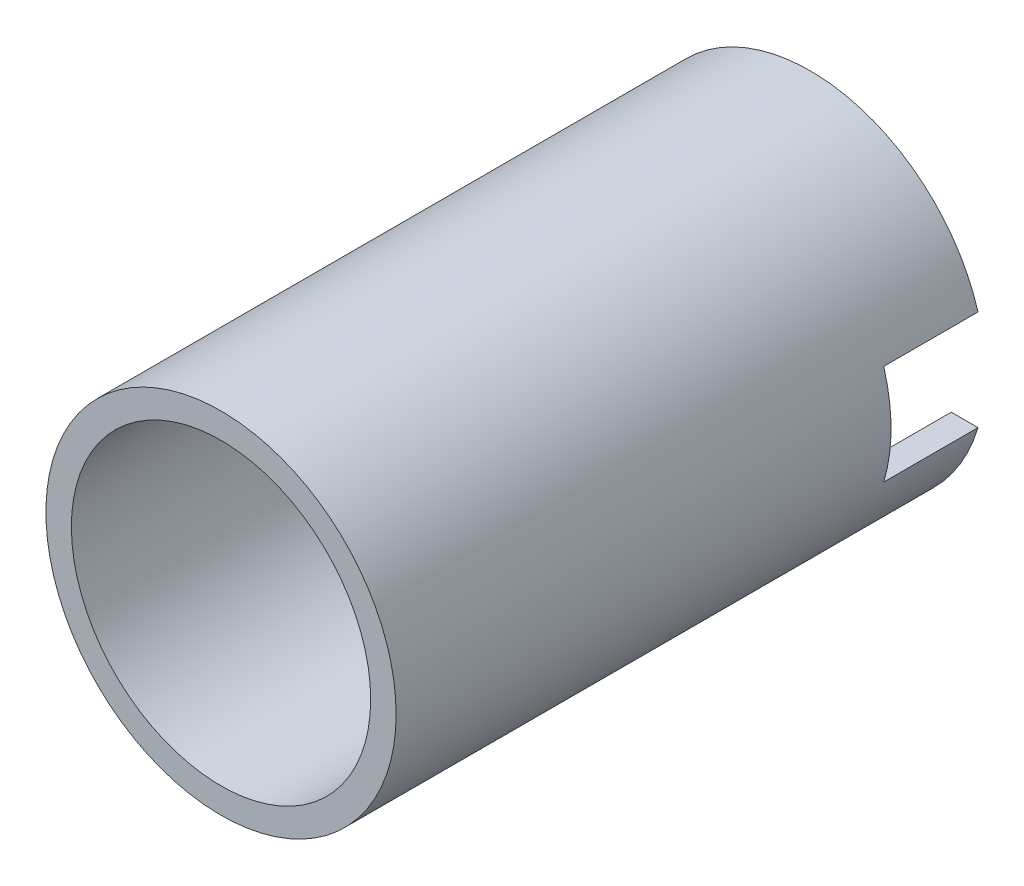
ISO-10303-21;
HEADER;
FILE_DESCRIPTION(('STEP AP214'),'2;1');
FILE_NAME('part.step','',(''),(''),'','','');
FILE_SCHEMA(('AUTOMOTIVE_DESIGN { 1 0 10303 214 1 1 1 1 }'));
ENDSEC;
DATA;
#1=APPLICATION_CONTEXT('core data for automotive mechanical design processes');
#2=APPLICATION_PROTOCOL_DEFINITION('international standard','automotive_design',2000,#1);
#3=PRODUCT_CONTEXT('',#1,'mechanical');
#4=PRODUCT('Part','Part','',(#3));
#5=PRODUCT_RELATED_PRODUCT_CATEGORY('part','',(#4));
#6=PRODUCT_DEFINITION_FORMATION('','',#4);
#7=PRODUCT_DEFINITION_CONTEXT('part definition',#1,'design');
#8=PRODUCT_DEFINITION('design','',#6,#7);
#9=PRODUCT_DEFINITION_SHAPE('','',#8);
#10=(LENGTH_UNIT() NAMED_UNIT(*) SI_UNIT(.MILLI.,.METRE.));
#11=(NAMED_UNIT(*) PLANE_ANGLE_UNIT() SI_UNIT($,.RADIAN.));
#12=(NAMED_UNIT(*) SI_UNIT($,.STERADIAN.) SOLID_ANGLE_UNIT());
#13=UNCERTAINTY_MEASURE_WITH_UNIT(LENGTH_MEASURE(1.E-05),#10,'distance_accuracy_value','');
#14=(GEOMETRIC_REPRESENTATION_CONTEXT(3) GLOBAL_UNCERTAINTY_ASSIGNED_CONTEXT((#13)) GLOBAL_UNIT_ASSIGNED_CONTEXT((#10,
#11,#12)) REPRESENTATION_CONTEXT('',''));
#15=CARTESIAN_POINT('',(0.,0.,0.));
#16=DIRECTION('',(0.,0.,1.));
#17=DIRECTION('',(1.,0.,0.));
#18=AXIS2_PLACEMENT_3D('',#15,#16,#17);
#19=CARTESIAN_POINT('',(0.,0.,0.));
#20=DIRECTION('',(0.,0.,1.));
#21=DIRECTION('',(1.,0.,0.));
#22=AXIS2_PLACEMENT_3D('',#19,#20,#21);
#23=PLANE('',#22);
#24=DIRECTION('',(-1.,0.,0.));
#25=VECTOR('',#24,1.);
#26=CARTESIAN_POINT('',(29.72,-8.5,0.));
#27=LINE('',#26,#25);
#28=CARTESIAN_POINT('',(28.478560356872,-8.5,0.));
#29=VERTEX_POINT('',#28);
#30=CARTESIAN_POINT('',(23.9355384313786,-8.5,0.));
#31=VERTEX_POINT('',#30);
#32=EDGE_CURVE('E191',#29,#31,#27,.T.);
#33=ORIENTED_EDGE('',*,*,#32,.F.);
#34=CARTESIAN_POINT('',(0.,0.,0.));
#35=DIRECTION('',(0.,0.,1.));
#36=DIRECTION('',(1.,0.,0.));
#37=AXIS2_PLACEMENT_3D('',#34,#35,#36);
#38=CIRCLE('',#37,29.72);
#39=CARTESIAN_POINT('',(-21.0304160681619,-21.,0.));
#40=VERTEX_POINT('',#39);
#41=EDGE_CURVE('E192',#40,#29,#38,.T.);
#42=ORIENTED_EDGE('',*,*,#41,.F.);
#43=DIRECTION('',(1.,0.,0.));
#44=VECTOR('',#43,1.);
#45=CARTESIAN_POINT('',(-29.72,-21.,0.));
#46=LINE('',#45,#44);
#47=CARTESIAN_POINT('',(-14.2884568795934,-21.,0.));
#48=VERTEX_POINT('',#47);
#49=EDGE_CURVE('E130',#40,#48,#46,.T.);
#50=ORIENTED_EDGE('',*,*,#49,.T.);
#51=CARTESIAN_POINT('',(0.,0.,0.));
#52=DIRECTION('',(0.,0.,1.));
#53=DIRECTION('',(1.,0.,0.));
#54=AXIS2_PLACEMENT_3D('',#51,#52,#53);
#55=CIRCLE('',#54,25.4);
#56=EDGE_CURVE('E194',#48,#31,#55,.T.);
#57=ORIENTED_EDGE('',*,*,#56,.T.);
#58=EDGE_LOOP('',(#33,#42,#50,#57));
#59=FACE_BOUND('',#58,.T.);
#60=ADVANCED_FACE('F39',(#59),#23,.F.);
#61=DIRECTION('',(-1.,0.,0.));
#62=VECTOR('',#61,1.);
#63=CARTESIAN_POINT('',(29.72,8.5,0.));
#64=LINE('',#63,#62);
#65=CARTESIAN_POINT('',(28.478560356872,8.5,0.));
#66=VERTEX_POINT('',#65);
#67=CARTESIAN_POINT('',(23.9355384313786,8.5,0.));
#68=VERTEX_POINT('',#67);
#69=EDGE_CURVE('E107',#66,#68,#64,.T.);
#70=ORIENTED_EDGE('',*,*,#69,.T.);
#71=CARTESIAN_POINT('',(-14.2884568795934,21.,0.));
#72=VERTEX_POINT('',#71);
#73=EDGE_CURVE('E63',#68,#72,#55,.T.);
#74=ORIENTED_EDGE('',*,*,#73,.T.);
#75=DIRECTION('',(1.,0.,0.));
#76=VECTOR('',#75,1.);
#77=CARTESIAN_POINT('',(-29.72,21.,0.));
#78=LINE('',#77,#76);
#79=CARTESIAN_POINT('',(-21.0304160681619,21.,0.));
#80=VERTEX_POINT('',#79);
#81=EDGE_CURVE('E124',#80,#72,#78,.T.);
#82=ORIENTED_EDGE('',*,*,#81,.F.);
#83=EDGE_CURVE('E200',#66,#80,#38,.T.);
#84=ORIENTED_EDGE('',*,*,#83,.F.);
#85=EDGE_LOOP('',(#70,#74,#82,#84));
#86=FACE_BOUND('',#85,.T.);
#87=ADVANCED_FACE('F182',(#86),#23,.F.);
#88=CARTESIAN_POINT('',(0.,0.,100.));
#89=DIRECTION('',(0.,0.,-1.));
#90=DIRECTION('',(-1.,0.,0.));
#91=AXIS2_PLACEMENT_3D('',#88,#89,#90);
#92=CYLINDRICAL_SURFACE('',#91,29.72);
#93=CARTESIAN_POINT('',(0.,0.,100.));
#94=DIRECTION('',(0.,0.,1.));
#95=DIRECTION('',(1.,0.,0.));
#96=AXIS2_PLACEMENT_3D('',#93,#94,#95);
#97=CIRCLE('',#96,29.72);
#98=CARTESIAN_POINT('',(29.72,0.,100.));
#99=VERTEX_POINT('',#98);
#100=EDGE_CURVE('E199',#99,#99,#97,.T.);
#101=ORIENTED_EDGE('',*,*,#100,.F.);
#102=EDGE_LOOP('',(#101));
#103=FACE_BOUND('',#102,.T.);
#104=CARTESIAN_POINT('',(0.,0.,16.));
#105=DIRECTION('',(0.,0.,-1.));
#106=DIRECTION('',(-1.,0.,0.));
#107=AXIS2_PLACEMENT_3D('',#104,#105,#106);
#108=CIRCLE('',#107,29.72);
#109=CARTESIAN_POINT('',(28.478560356872,8.5,16.));
#110=VERTEX_POINT('',#109);
#111=CARTESIAN_POINT('',(28.478560356872,-8.5,16.));
#112=VERTEX_POINT('',#111);
#113=EDGE_CURVE('E117',#110,#112,#108,.T.);
#114=ORIENTED_EDGE('',*,*,#113,.F.);
#115=DIRECTION('',(0.,0.,-1.));
#116=VECTOR('',#115,1.);
#117=CARTESIAN_POINT('',(28.478560356872,8.49999999999999,100.));
#118=LINE('',#117,#116);
#119=EDGE_CURVE('E105',#66,#110,#118,.F.);
#120=ORIENTED_EDGE('',*,*,#119,.F.);
#121=ORIENTED_EDGE('',*,*,#83,.T.);
#122=DIRECTION('',(0.,0.,-1.));
#123=VECTOR('',#122,1.);
#124=CARTESIAN_POINT('',(-21.0304160681619,21.,100.));
#125=LINE('',#124,#123);
#126=CARTESIAN_POINT('',(-21.0304160681619,21.,21.));
#127=VERTEX_POINT('',#126);
#128=EDGE_CURVE('E133',#80,#127,#125,.F.);
#129=ORIENTED_EDGE('',*,*,#128,.T.);
#130=CARTESIAN_POINT('',(-21.0304160681618,21.,21.));
#131=CARTESIAN_POINT('',(-21.0303937387405,21.0000099460655,21.2531665226654));
#132=CARTESIAN_POINT('',(-21.0349869765268,20.9954221708271,21.5063240457274));
#133=CARTESIAN_POINT('',(-21.053238920108,20.9771264880917,22.0119509963942));
#134=CARTESIAN_POINT('',(-21.0668964815835,20.9634197318138,22.2644205068174));
#135=CARTESIAN_POINT('',(-21.1030823693739,20.9269906722506,22.7676606723232));
#136=CARTESIAN_POINT('',(-21.1255963974352,20.9042829001355,23.0184334062395));
#137=CARTESIAN_POINT('',(-21.1791735636629,20.8499987791319,23.5180808337789));
#138=CARTESIAN_POINT('',(-21.2102368891098,20.8184222359642,23.7669554856998));
#139=CARTESIAN_POINT('',(-21.3148829903586,20.7114505636986,24.5043491672356));
#140=CARTESIAN_POINT('',(-21.4003562155716,20.6233856075302,24.9894398506764));
#141=CARTESIAN_POINT('',(-21.599287767454,20.4149405917559,25.9467664451234));
#142=CARTESIAN_POINT('',(-21.7127563536225,20.2945486838151,26.4189975728649));
#143=CARTESIAN_POINT('',(-21.9622978357655,20.0242216777128,27.3452179207687));
#144=CARTESIAN_POINT('',(-22.0982209224016,19.8744812256252,27.7993047968412));
#145=CARTESIAN_POINT('',(-22.3886330255385,19.546749423862,28.6909185997043));
#146=CARTESIAN_POINT('',(-22.5431207507473,19.3687600388086,29.1284466754874));
#147=CARTESIAN_POINT('',(-22.866869124726,18.9854629357874,29.9874401593784));
#148=CARTESIAN_POINT('',(-23.0361733940266,18.7800735522032,30.4088525059257));
#149=CARTESIAN_POINT('',(-23.3852005886823,18.3436336652396,31.2337125619211));
#150=CARTESIAN_POINT('',(-23.56492499928,18.1125794993917,31.637157695837));
#151=CARTESIAN_POINT('',(-23.9637633729296,17.5825223735878,32.4957701523908));
#152=CARTESIAN_POINT('',(-24.1841992567262,17.2787423631686,32.9473798483098));
#153=CARTESIAN_POINT('',(-24.6292630785128,16.6382076010158,33.8243884602881));
#154=CARTESIAN_POINT('',(-24.853891323879,16.3014504237084,34.2497854445654));
#155=CARTESIAN_POINT('',(-25.3027013458173,15.5957251846895,35.0736511664465));
#156=CARTESIAN_POINT('',(-25.5268828586096,15.226741849263,35.4721069747048));
#157=CARTESIAN_POINT('',(-25.9702980539063,14.457495686447,36.2406182777524));
#158=CARTESIAN_POINT('',(-26.1895313865057,14.0572306558832,36.6106717685179));
#159=CARTESIAN_POINT('',(-26.6557818667184,13.1547681664907,37.3817634392792));
#160=CARTESIAN_POINT('',(-26.9011011268,12.6468729513053,37.7772017166872));
#161=CARTESIAN_POINT('',(-27.3727189662431,11.5908260436907,38.5234389109176));
#162=CARTESIAN_POINT('',(-27.5990139317568,11.0426667395994,38.8742293529297));
#163=CARTESIAN_POINT('',(-28.0258952208721,9.90925641324236,39.5265524840307));
#164=CARTESIAN_POINT('',(-28.2265204090004,9.32406351754197,39.8281598319585));
#165=CARTESIAN_POINT('',(-28.5037318827736,8.42110186372119,40.2404417968196));
#166=CARTESIAN_POINT('',(-28.5921728265259,8.11595450938322,40.3711686644321));
#167=CARTESIAN_POINT('',(-28.7604950500948,7.49766414302856,40.6187648129704));
#168=CARTESIAN_POINT('',(-28.8403742239258,7.18451918714617,40.7356306851809));
#169=CARTESIAN_POINT('',(-29.0248896912711,6.40762752852184,41.0044811787526));
#170=CARTESIAN_POINT('',(-29.1243788227264,5.93983515760246,41.1484369356916));
#171=CARTESIAN_POINT('',(-29.3017885917567,4.99161311158772,41.4040406550153));
#172=CARTESIAN_POINT('',(-29.3797138642842,4.51118617652332,41.5156955604048));
#173=CARTESIAN_POINT('',(-29.5123756613789,3.54085651677596,41.7052288428678));
#174=CARTESIAN_POINT('',(-29.56712714406,3.05096011862318,41.783129008573));
#175=CARTESIAN_POINT('',(-29.6523204414361,2.06476345370417,41.9041516934751));
#176=CARTESIAN_POINT('',(-29.6827614245106,1.56846296845519,41.947273022948));
#177=CARTESIAN_POINT('',(-29.7186820096651,0.572125481933786,41.9981424842876));
#178=CARTESIAN_POINT('',(-29.7241105368803,0.0720829217335501,42.0058182371656));
#179=CARTESIAN_POINT('',(-29.7097424070685,-0.926907018870273,41.9854817637028));
#180=CARTESIAN_POINT('',(-29.689945844991,-1.42585440338913,41.9574696716944));
#181=CARTESIAN_POINT('',(-29.6255722723503,-2.41900067834989,41.8661730375163));
#182=CARTESIAN_POINT('',(-29.5809894905946,-2.91319843562249,41.8028802806318));
#183=CARTESIAN_POINT('',(-29.4680303776981,-3.89318478855849,41.641940232984));
#184=CARTESIAN_POINT('',(-29.3996540494375,-4.37897338523982,41.5442929463793));
#185=CARTESIAN_POINT('',(-29.2425074000089,-5.3272431239618,41.3187649903124));
#186=CARTESIAN_POINT('',(-29.154275121329,-5.79000375342878,41.1916797385128));
#187=CARTESIAN_POINT('',(-28.9582424844381,-6.70194955735502,40.9075858717279));
#188=CARTESIAN_POINT('',(-28.8504425792944,-7.15113504585115,40.7505779495655));
#189=CARTESIAN_POINT('',(-28.6171980141967,-8.03385374635203,40.4082794828932));
#190=CARTESIAN_POINT('',(-28.4917528188852,-8.46738648295111,40.2229880802489));
#191=CARTESIAN_POINT('',(-28.2252974627454,-9.31715195258773,39.8257989260061));
#192=CARTESIAN_POINT('',(-28.0842854120856,-9.73338257666982,39.6138979435482));
#193=CARTESIAN_POINT('',(-27.7723562047672,-10.5927466047023,39.1400293943521));
#194=CARTESIAN_POINT('',(-27.5998583224136,-11.0336802480143,38.8751127861022));
#195=CARTESIAN_POINT('',(-27.2414134874037,-11.89116449058,38.3165267568248));
#196=CARTESIAN_POINT('',(-27.0554656812073,-12.3077135393324,38.0228555105916));
#197=CARTESIAN_POINT('',(-26.6730945949545,-13.1158072820695,37.4083363519947));
#198=CARTESIAN_POINT('',(-26.4766620350344,-13.5073291282416,37.0874642117914));
#199=CARTESIAN_POINT('',(-26.0766904093563,-14.2642165050122,36.4203324922541));
#200=CARTESIAN_POINT('',(-25.8731510045331,-14.6295807850983,36.0740717007667));
#201=CARTESIAN_POINT('',(-25.4250176279523,-15.3973558826045,35.2924292183029));
#202=CARTESIAN_POINT('',(-25.1796696178339,-15.7944770980498,34.8522701444607));
#203=CARTESIAN_POINT('',(-24.6894233334633,-16.5503396157608,33.9397591139392));
#204=CARTESIAN_POINT('',(-24.4445251626825,-16.9090729659369,33.4674005201401));
#205=CARTESIAN_POINT('',(-23.9615040850206,-17.5868678455513,32.4915240709928));
#206=CARTESIAN_POINT('',(-23.7233828731231,-17.905919516303,31.9879985187427));
#207=CARTESIAN_POINT('',(-23.2611692110297,-18.5023963679394,30.9508298764412));
#208=CARTESIAN_POINT('',(-23.0370724384137,-18.7798344115933,30.4171961632961));
#209=CARTESIAN_POINT('',(-22.6596833412603,-19.2323454930827,29.4459853609845));
#210=CARTESIAN_POINT('',(-22.5019059692038,-19.4163285414352,29.0142895955192));
#211=CARTESIAN_POINT('',(-22.203698772232,-19.7566532791241,28.1342250276218));
#212=CARTESIAN_POINT('',(-22.0632688531477,-19.9129951185103,27.6858563157143));
#213=CARTESIAN_POINT('',(-21.8046632584938,-20.1958334908468,26.775358327489));
#214=CARTESIAN_POINT('',(-21.6864107979382,-20.3224333990057,26.313283195043));
#215=CARTESIAN_POINT('',(-21.476017140877,-20.5446488851225,25.375967848692));
#216=CARTESIAN_POINT('',(-21.3838650903685,-20.6402773451132,24.9007331977708));
#217=CARTESIAN_POINT('',(-21.2618562737605,-20.7657399595802,24.1407804506207));
#218=CARTESIAN_POINT('',(-21.2220553394639,-20.8063732219774,23.8593782560925));
#219=CARTESIAN_POINT('',(-21.1532888968806,-20.8762826538554,23.2938924678128));
#220=CARTESIAN_POINT('',(-21.1243208600519,-20.9055614736728,23.0098095156771));
#221=CARTESIAN_POINT('',(-21.0776399558517,-20.9526289290515,22.4386534898456));
#222=CARTESIAN_POINT('',(-21.0599711877805,-20.970372548918,22.1515730916456));
#223=CARTESIAN_POINT('',(-21.0363381737395,-20.9940688044891,21.576333751277));
#224=CARTESIAN_POINT('',(-21.030378560281,-21.0000167734704,21.2881744274051));
#225=CARTESIAN_POINT('',(-21.0304160681618,-21.,21.));
#226=B_SPLINE_CURVE_WITH_KNOTS('',3,(#130,#131,#132,#133,#134,#135,#136,#137,#138,#139,#140,
#141,#142,#143,#144,#145,#146,#147,#148,#149,#150,#151,#152,#153,#154,#155,#156,#157,#158,#159,
#160,#161,#162,#163,#164,#165,#166,#167,#168,#169,#170,#171,#172,#173,#174,#175,#176,#177,#178,
#179,#180,#181,#182,#183,#184,#185,#186,#187,#188,#189,#190,#191,#192,#193,#194,#195,#196,#197,
#198,#199,#200,#201,#202,#203,#204,#205,#206,#207,#208,#209,#210,#211,#212,#213,#214,#215,#216,
#217,#218,#219,#220,#221,#222,#223,#224,#225),.UNSPECIFIED.,.F.,.F.,(4,2,2,2,2,2,2,2,2,2,2,2,2,
2,2,2,2,2,2,2,2,2,2,2,2,2,2,2,2,2,2,2,2,2,2,2,2,2,2,2,2,2,2,2,2,2,2,4),(0.,0.759401100919947,
1.51870634999667,2.27679074271707,3.0348917433215,4.53366612115254,6.03299057490169,
7.52268856164273,9.01228299004724,10.5064207068484,12.0007719177494,13.7608152785095,
15.520988193345,17.2819999238568,19.0431357946445,21.1068504583554,23.1709562628627,
25.2318990315532,26.2621418515439,27.2926375072549,28.7893023137897,30.2856451757153,
31.7810207065366,33.2764473894003,34.7749263501247,36.2733996704487,37.7722220396392,
39.2710442273941,40.7333128055221,42.1955475307213,43.6578266296459,45.1202834463163,
46.7463517392015,48.3725233140497,50.0001588530243,51.6278721523408,53.5506340686197,
55.4737935192871,57.3974298175346,59.3204702891554,60.8045120625778,62.2885457796687,
63.7673424358241,65.2455232200717,66.1064188727328,66.9671134553209,67.8311470190599,
68.6955223529798),.UNSPECIFIED.);
#227=CARTESIAN_POINT('',(-21.0304160681618,-21.,21.));
#228=VERTEX_POINT('',#227);
#229=EDGE_CURVE('E141',#127,#228,#226,.T.);
#230=ORIENTED_EDGE('',*,*,#229,.T.);
#231=DIRECTION('',(0.,0.,-1.));
#232=VECTOR('',#231,1.);
#233=CARTESIAN_POINT('',(-21.0304160681619,-21.,100.));
#234=LINE('',#233,#232);
#235=EDGE_CURVE('E148',#228,#40,#234,.T.);
#236=ORIENTED_EDGE('',*,*,#235,.T.);
#237=ORIENTED_EDGE('',*,*,#41,.T.);
#238=DIRECTION('',(0.,0.,-1.));
#239=VECTOR('',#238,1.);
#240=CARTESIAN_POINT('',(28.478560356872,-8.50000000000002,100.));
#241=LINE('',#240,#239);
#242=EDGE_CURVE('E111',#112,#29,#241,.T.);
#243=ORIENTED_EDGE('',*,*,#242,.F.);
#244=EDGE_LOOP('',(#114,#120,#121,#129,#230,#236,#237,#243));
#245=FACE_BOUND('',#244,.T.);
#246=ADVANCED_FACE('F41',(#103,#245),#92,.T.);
#247=CARTESIAN_POINT('',(0.,0.,100.));
#248=DIRECTION('',(0.,0.,-1.));
#249=DIRECTION('',(-1.,0.,0.));
#250=AXIS2_PLACEMENT_3D('',#247,#248,#249);
#251=CYLINDRICAL_SURFACE('',#250,25.4);
#252=CARTESIAN_POINT('',(0.,0.,100.));
#253=DIRECTION('',(0.,0.,1.));
#254=DIRECTION('',(1.,0.,0.));
#255=AXIS2_PLACEMENT_3D('',#252,#253,#254);
#256=CIRCLE('',#255,25.4);
#257=CARTESIAN_POINT('',(25.4,0.,100.));
#258=VERTEX_POINT('',#257);
#259=EDGE_CURVE('E203',#258,#258,#256,.T.);
#260=ORIENTED_EDGE('',*,*,#259,.T.);
#261=EDGE_LOOP('',(#260));
#262=FACE_BOUND('',#261,.T.);
#263=CARTESIAN_POINT('',(0.,0.,16.));
#264=DIRECTION('',(0.,0.,-1.));
#265=DIRECTION('',(-1.,0.,0.));
#266=AXIS2_PLACEMENT_3D('',#263,#264,#265);
#267=CIRCLE('',#266,25.4);
#268=CARTESIAN_POINT('',(23.9355384313786,8.49999999999999,16.));
#269=VERTEX_POINT('',#268);
#270=CARTESIAN_POINT('',(23.9355384313785,-8.5,16.));
#271=VERTEX_POINT('',#270);
#272=EDGE_CURVE('E48',#269,#271,#267,.T.);
#273=ORIENTED_EDGE('',*,*,#272,.T.);
#274=DIRECTION('',(0.,0.,-1.));
#275=VECTOR('',#274,1.);
#276=CARTESIAN_POINT('',(23.9355384313785,-8.50000000000002,100.));
#277=LINE('',#276,#275);
#278=EDGE_CURVE('E11',#271,#31,#277,.T.);
#279=ORIENTED_EDGE('',*,*,#278,.T.);
#280=ORIENTED_EDGE('',*,*,#56,.F.);
#281=DIRECTION('',(0.,0.,-1.));
#282=VECTOR('',#281,1.);
#283=CARTESIAN_POINT('',(-14.2884568795934,-21.,100.));
#284=LINE('',#283,#282);
#285=CARTESIAN_POINT('',(-14.2884568795934,-21.,21.));
#286=VERTEX_POINT('',#285);
#287=EDGE_CURVE('E169',#286,#48,#284,.T.);
#288=ORIENTED_EDGE('',*,*,#287,.F.);
#289=CARTESIAN_POINT('',(-14.2884568795934,21.,21.));
#290=CARTESIAN_POINT('',(-14.2884447625894,21.0000033749037,21.1899790980409));
#291=CARTESIAN_POINT('',(-14.2922477279159,20.9974212199639,21.3799276949881));
#292=CARTESIAN_POINT('',(-14.3073672775332,20.9871238125037,21.7593608649071));
#293=CARTESIAN_POINT('',(-14.3186828305655,20.9794092645105,21.9488454979849));
#294=CARTESIAN_POINT('',(-14.3636622995886,20.9486658733061,22.5152853621521));
#295=CARTESIAN_POINT('',(-14.4083600113061,20.9180369373555,22.8910253724591));
#296=CARTESIAN_POINT('',(-14.5240702801323,20.8378546325742,23.6306495817252));
#297=CARTESIAN_POINT('',(-14.5946951846472,20.7885797323447,23.9946265701673));
#298=CARTESIAN_POINT('',(-14.7592179933129,20.6720977961352,24.714488047713));
#299=CARTESIAN_POINT('',(-14.8531284846706,20.6048810600467,25.0703680459582));
#300=CARTESIAN_POINT('',(-15.1010687831032,20.4242368212394,25.909106887154));
#301=CARTESIAN_POINT('',(-15.2642798232464,20.3030020769787,26.3875716165419));
#302=CARTESIAN_POINT('',(-15.6196944118098,20.0308563475805,27.3248092167741));
#303=CARTESIAN_POINT('',(-15.8119092898263,19.879933758631,27.7835743021084));
#304=CARTESIAN_POINT('',(-16.218937966637,19.5493044759006,28.6848459870555));
#305=CARTESIAN_POINT('',(-16.4339144464384,19.369385004142,29.1272001180679));
#306=CARTESIAN_POINT('',(-16.8785689032647,18.9831697098879,29.9924244955454));
#307=CARTESIAN_POINT('',(-17.1082466485596,18.7768743030943,30.4152950489415));
#308=CARTESIAN_POINT('',(-17.6763911573714,18.2459201121143,31.4178154509293));
#309=CARTESIAN_POINT('',(-18.0196655785432,17.9081808730838,31.9878512350089));
#310=CARTESIAN_POINT('',(-18.7128252347941,17.1826173361917,33.0910543068616));
#311=CARTESIAN_POINT('',(-19.0627131111267,16.7947726505295,33.6242064504136));
#312=CARTESIAN_POINT('',(-19.7584205037172,15.9704464977782,34.6520264688576));
#313=CARTESIAN_POINT('',(-20.1042470423108,15.5340693001869,35.1467731136471));
#314=CARTESIAN_POINT('',(-20.7838945978832,14.6122384884502,36.0970318180665));
#315=CARTESIAN_POINT('',(-21.1177200063021,14.126803078616,36.5525583159805));
#316=CARTESIAN_POINT('',(-21.6977037694912,13.2135578772573,37.3304192585782));
#317=CARTESIAN_POINT('',(-21.9476123873658,12.7948815172296,37.6607036602338));
#318=CARTESIAN_POINT('',(-22.4309428592528,11.9272509601733,38.2924429652979));
#319=CARTESIAN_POINT('',(-22.6643653646565,11.4782979607924,38.5938990079255));
#320=CARTESIAN_POINT('',(-23.1104141651638,10.5514446452041,39.164882306532));
#321=CARTESIAN_POINT('',(-23.3230628444308,10.0735764055672,39.4344439968995));
#322=CARTESIAN_POINT('',(-23.7237171830023,9.08994334184529,39.9388019278312));
#323=CARTESIAN_POINT('',(-23.911727238442,8.58418351724688,40.1736043712702));
#324=CARTESIAN_POINT('',(-24.2293637739653,7.63568199326326,40.5681706512542));
#325=CARTESIAN_POINT('',(-24.3634780645302,7.19691898130388,40.7339018452089));
#326=CARTESIAN_POINT('',(-24.6097066010064,6.30371743826273,41.0371028728417));
#327=CARTESIAN_POINT('',(-24.7218231548894,5.84928055755003,41.1745756714234));
#328=CARTESIAN_POINT('',(-24.9219537753046,4.92733357729242,41.4193227365733));
#329=CARTESIAN_POINT('',(-25.009977970144,4.45982906269571,41.5266096936504));
#330=CARTESIAN_POINT('',(-25.160228168482,3.51453084939908,41.709413198866));
#331=CARTESIAN_POINT('',(-25.2224538727732,3.03673703143282,41.7849293785315));
#332=CARTESIAN_POINT('',(-25.319976387358,2.07234773511559,41.903165524475));
#333=CARTESIAN_POINT('',(-25.3551613728218,1.58572413584341,41.9457493058377));
#334=CARTESIAN_POINT('',(-25.397386862469,0.60946324214964,41.996844228367));
#335=CARTESIAN_POINT('',(-25.4044273081557,0.119825941466346,42.0053552987154));
#336=CARTESIAN_POINT('',(-25.3902031588139,-0.858416308167837,41.9881499642854));
#337=CARTESIAN_POINT('',(-25.3689392900978,-1.34702128328682,41.9624344377901));
#338=CARTESIAN_POINT('',(-25.2985905377451,-2.31923309214386,41.8772426505342));
#339=CARTESIAN_POINT('',(-25.2495065443014,-2.80284008530402,41.8177674700205));
#340=CARTESIAN_POINT('',(-25.1286525509181,-3.73031031051145,41.6710132183837));
#341=CARTESIAN_POINT('',(-25.0585564643526,-4.17472002324484,41.5857828327882));
#342=CARTESIAN_POINT('',(-24.8962709410151,-5.05323852132273,41.3879255800469));
#343=CARTESIAN_POINT('',(-24.8040826639237,-5.48734784604923,41.2753001509388));
#344=CARTESIAN_POINT('',(-24.5991691250575,-6.34306688469089,41.0240954688853));
#345=CARTESIAN_POINT('',(-24.4864406813761,-6.76467465018947,40.88551219468));
#346=CARTESIAN_POINT('',(-24.2422270006176,-7.59349187421589,40.5840083757794));
#347=CARTESIAN_POINT('',(-24.1107406568363,-8.00070048143231,40.4210863950889));
#348=CARTESIAN_POINT('',(-23.8185785074864,-8.8344339028244,40.0572155507524));
#349=CARTESIAN_POINT('',(-23.6563521672659,-9.25950432075436,39.8541818465401));
#350=CARTESIAN_POINT('',(-23.3144272503884,-10.0895494262075,39.4233464929602));
#351=CARTESIAN_POINT('',(-23.1347278395478,-10.4945231528971,39.1955436610258));
#352=CARTESIAN_POINT('',(-22.7603221366705,-11.2835481043919,38.7170671101527));
#353=CARTESIAN_POINT('',(-22.5656131231526,-11.6675955132724,38.4663892420827));
#354=CARTESIAN_POINT('',(-22.1636630093394,-12.4141788539903,37.9439019995918));
#355=CARTESIAN_POINT('',(-21.9564201566084,-12.7767117636445,37.6720896687029));
#356=CARTESIAN_POINT('',(-21.4877682049951,-13.5529245023965,37.0503644475176));
#357=CARTESIAN_POINT('',(-21.2240432015724,-13.961606476948,36.6959494464616));
#358=CARTESIAN_POINT('',(-20.6861039726374,-14.7469212431039,35.9605414840493));
#359=CARTESIAN_POINT('',(-20.4118881741583,-15.1235492010846,35.5795445299437));
#360=CARTESIAN_POINT('',(-19.8569190427985,-15.8451957795267,34.7918642298819));
#361=CARTESIAN_POINT('',(-19.5761565841889,-16.190166502604,34.3851434845668));
#362=CARTESIAN_POINT('',(-19.0131620737621,-16.8477584554861,33.5473749905875));
#363=CARTESIAN_POINT('',(-18.7309301340584,-17.1603821162859,33.1163290738129));
#364=CARTESIAN_POINT('',(-18.1723275139603,-17.7507849398603,32.2334124789262));
#365=CARTESIAN_POINT('',(-17.895928619998,-18.0288102855482,31.781724440525));
#366=CARTESIAN_POINT('',(-17.3527929061108,-18.5521633328596,30.8539817304015));
#367=CARTESIAN_POINT('',(-17.0860582793986,-18.7974836458192,30.3779215860829));
#368=CARTESIAN_POINT('',(-16.570203651606,-19.2537454169687,29.4013913150511));
#369=CARTESIAN_POINT('',(-16.3210583722273,-19.4647368043425,28.9009580402128));
#370=CARTESIAN_POINT('',(-15.8495389833911,-19.8505613135681,27.8742690075693));
#371=CARTESIAN_POINT('',(-15.6271476635075,-20.0254177330471,27.3480301601654));
#372=CARTESIAN_POINT('',(-15.2936883223597,-20.2802903832259,26.4625673953808));
#373=CARTESIAN_POINT('',(-15.1712535401738,-20.3718589726005,26.1109287382181));
#374=CARTESIAN_POINT('',(-14.9459677456613,-20.5377118149821,25.397331774275));
#375=CARTESIAN_POINT('',(-14.8431172321246,-20.6119956277752,25.0353732049276));
#376=CARTESIAN_POINT('',(-14.6611290142567,-20.7418367612683,24.3036014266085));
#377=CARTESIAN_POINT('',(-14.5819079026838,-20.7974600389566,23.9338209006008));
#378=CARTESIAN_POINT('',(-14.4502379399086,-20.8891626078898,23.1872622380136));
#379=CARTESIAN_POINT('',(-14.3977716301603,-20.9252546449704,22.8104888313678));
#380=CARTESIAN_POINT('',(-14.3363343777148,-20.9673634883487,22.1942781195284));
#381=CARTESIAN_POINT('',(-14.3184368137756,-20.9795786683269,21.9561155663358));
#382=CARTESIAN_POINT('',(-14.2944720723405,-20.9959075676813,21.478651170406));
#383=CARTESIAN_POINT('',(-14.2884183099306,-21.0000121004456,21.2393483431725));
#384=CARTESIAN_POINT('',(-14.2884568795934,-21.,21.));
#385=B_SPLINE_CURVE_WITH_KNOTS('',3,(#289,#290,#291,#292,#293,#294,#295,#296,#297,#298,#299,
#300,#301,#302,#303,#304,#305,#306,#307,#308,#309,#310,#311,#312,#313,#314,#315,#316,#317,#318,
#319,#320,#321,#322,#323,#324,#325,#326,#327,#328,#329,#330,#331,#332,#333,#334,#335,#336,#337,
#338,#339,#340,#341,#342,#343,#344,#345,#346,#347,#348,#349,#350,#351,#352,#353,#354,#355,#356,
#357,#358,#359,#360,#361,#362,#363,#364,#365,#366,#367,#368,#369,#370,#371,#372,#373,#374,#375,
#376,#377,#378,#379,#380,#381,#382,#383,#384),.UNSPECIFIED.,.F.,.F.,(4,2,2,2,2,2,2,2,2,2,2,2,2,
2,2,2,2,2,2,2,2,2,2,2,2,2,2,2,2,2,2,2,2,2,2,2,2,2,2,2,2,2,2,2,2,2,2,4),(0.,0.569822785320295,
1.13956736680672,2.27667001557045,3.39742103235389,4.51877920571959,6.07587219244305,
7.63357499927888,9.20327733201823,10.7729549282836,13.0086927633383,15.2453431976812,
17.4772778959363,19.7083873974632,21.4736117207058,23.2387662581911,25.0019973320309,
26.764913372582,28.2269188782515,29.6887709102266,31.1500074396761,32.6112609158756,
34.0785252534945,35.5457926407413,37.0130223774102,38.4802051680731,39.8524279491759,
41.2245787142484,42.5969422221418,43.9693867321263,45.4626273027475,46.9559391973545,
48.449522493064,49.9433151010884,51.7470927303457,53.5511418822362,55.3578770456458,
57.1644763278206,58.9573801563004,60.7506883505485,62.5413645173459,64.3308825382014,
65.4803359837568,66.6298187007286,67.7751945962074,68.9198221300042,69.6368594282519,
70.3547084220409),.UNSPECIFIED.);
#386=CARTESIAN_POINT('',(-14.2884568795934,21.,21.));
#387=VERTEX_POINT('',#386);
#388=EDGE_CURVE('E162',#387,#286,#385,.T.);
#389=ORIENTED_EDGE('',*,*,#388,.F.);
#390=DIRECTION('',(0.,0.,-1.));
#391=VECTOR('',#390,1.);
#392=CARTESIAN_POINT('',(-14.2884568795934,21.,100.));
#393=LINE('',#392,#391);
#394=EDGE_CURVE('E170',#72,#387,#393,.F.);
#395=ORIENTED_EDGE('',*,*,#394,.F.);
#396=ORIENTED_EDGE('',*,*,#73,.F.);
#397=DIRECTION('',(0.,0.,-1.));
#398=VECTOR('',#397,1.);
#399=CARTESIAN_POINT('',(23.9355384313786,8.49999999999999,100.));
#400=LINE('',#399,#398);
#401=EDGE_CURVE('E209',#68,#269,#400,.F.);
#402=ORIENTED_EDGE('',*,*,#401,.T.);
#403=EDGE_LOOP('',(#273,#279,#280,#288,#389,#395,#396,#402));
#404=FACE_BOUND('',#403,.T.);
#405=ADVANCED_FACE('F173',(#262,#404),#251,.F.);
#406=CARTESIAN_POINT('',(0.,0.,100.));
#407=DIRECTION('',(0.,0.,1.));
#408=DIRECTION('',(1.,0.,0.));
#409=AXIS2_PLACEMENT_3D('',#406,#407,#408);
#410=PLANE('',#409);
#411=ORIENTED_EDGE('',*,*,#100,.T.);
#412=EDGE_LOOP('',(#411));
#413=FACE_BOUND('',#412,.T.);
#414=ORIENTED_EDGE('',*,*,#259,.F.);
#415=EDGE_LOOP('',(#414));
#416=FACE_BOUND('',#415,.T.);
#417=ADVANCED_FACE('F177',(#413,#416),#410,.T.);
#418=CARTESIAN_POINT('',(-29.72,-21.,21.));
#419=DIRECTION('',(0.,-1.,0.));
#420=DIRECTION('',(0.,0.,-1.));
#421=AXIS2_PLACEMENT_3D('',#418,#419,#420);
#422=PLANE('',#421);
#423=DIRECTION('',(1.,0.,0.));
#424=VECTOR('',#423,1.);
#425=CARTESIAN_POINT('',(-29.72,-21.,21.));
#426=LINE('',#425,#424);
#427=EDGE_CURVE('E134',#228,#286,#426,.T.);
#428=ORIENTED_EDGE('',*,*,#427,.T.);
#429=ORIENTED_EDGE('',*,*,#287,.T.);
#430=ORIENTED_EDGE('',*,*,#49,.F.);
#431=ORIENTED_EDGE('',*,*,#235,.F.);
#432=EDGE_LOOP('',(#428,#429,#430,#431));
#433=FACE_BOUND('',#432,.T.);
#434=ADVANCED_FACE('F156',(#433),#422,.F.);
#435=CARTESIAN_POINT('',(-29.72,0.,21.));
#436=DIRECTION('',(1.,0.,0.));
#437=DIRECTION('',(0.,0.,-1.));
#438=AXIS2_PLACEMENT_3D('',#435,#436,#437);
#439=CYLINDRICAL_SURFACE('',#438,21.);
#440=DIRECTION('',(1.,0.,0.));
#441=VECTOR('',#440,1.);
#442=CARTESIAN_POINT('',(-29.72,21.,21.));
#443=LINE('',#442,#441);
#444=EDGE_CURVE('E126',#127,#387,#443,.T.);
#445=ORIENTED_EDGE('',*,*,#444,.T.);
#446=ORIENTED_EDGE('',*,*,#388,.T.);
#447=ORIENTED_EDGE('',*,*,#427,.F.);
#448=ORIENTED_EDGE('',*,*,#229,.F.);
#449=EDGE_LOOP('',(#445,#446,#447,#448));
#450=FACE_BOUND('',#449,.T.);
#451=ADVANCED_FACE('F150',(#450),#439,.F.);
#452=CARTESIAN_POINT('',(-29.72,21.,0.));
#453=DIRECTION('',(0.,1.,0.));
#454=DIRECTION('',(0.,0.,1.));
#455=AXIS2_PLACEMENT_3D('',#452,#453,#454);
#456=PLANE('',#455);
#457=ORIENTED_EDGE('',*,*,#81,.T.);
#458=ORIENTED_EDGE('',*,*,#394,.T.);
#459=ORIENTED_EDGE('',*,*,#444,.F.);
#460=ORIENTED_EDGE('',*,*,#128,.F.);
#461=EDGE_LOOP('',(#457,#458,#459,#460));
#462=FACE_BOUND('',#461,.T.);
#463=ADVANCED_FACE('F155',(#462),#456,.F.);
#464=CARTESIAN_POINT('',(29.72,-8.5,16.));
#465=DIRECTION('',(0.,0.,-1.));
#466=DIRECTION('',(-1.,0.,0.));
#467=AXIS2_PLACEMENT_3D('',#464,#465,#466);
#468=PLANE('',#467);
#469=ORIENTED_EDGE('',*,*,#113,.T.);
#470=DIRECTION('',(-1.,0.,0.));
#471=VECTOR('',#470,1.);
#472=CARTESIAN_POINT('',(29.72,-8.5,16.));
#473=LINE('',#472,#471);
#474=EDGE_CURVE('E112',#112,#271,#473,.T.);
#475=ORIENTED_EDGE('',*,*,#474,.T.);
#476=ORIENTED_EDGE('',*,*,#272,.F.);
#477=DIRECTION('',(-1.,0.,0.));
#478=VECTOR('',#477,1.);
#479=CARTESIAN_POINT('',(29.72,8.5,16.));
#480=LINE('',#479,#478);
#481=EDGE_CURVE('E55',#110,#269,#480,.T.);
#482=ORIENTED_EDGE('',*,*,#481,.F.);
#483=EDGE_LOOP('',(#469,#475,#476,#482));
#484=FACE_BOUND('',#483,.T.);
#485=ADVANCED_FACE('F115',(#484),#468,.T.);
#486=CARTESIAN_POINT('',(29.72,-8.5,0.));
#487=DIRECTION('',(0.,1.,0.));
#488=DIRECTION('',(0.,0.,1.));
#489=AXIS2_PLACEMENT_3D('',#486,#487,#488);
#490=PLANE('',#489);
#491=ORIENTED_EDGE('',*,*,#242,.T.);
#492=ORIENTED_EDGE('',*,*,#32,.T.);
#493=ORIENTED_EDGE('',*,*,#278,.F.);
#494=ORIENTED_EDGE('',*,*,#474,.F.);
#495=EDGE_LOOP('',(#491,#492,#493,#494));
#496=FACE_BOUND('',#495,.T.);
#497=ADVANCED_FACE('F220',(#496),#490,.T.);
#498=CARTESIAN_POINT('',(29.72,8.5,0.));
#499=DIRECTION('',(0.,-1.,0.));
#500=DIRECTION('',(0.,0.,-1.));
#501=AXIS2_PLACEMENT_3D('',#498,#499,#500);
#502=PLANE('',#501);
#503=ORIENTED_EDGE('',*,*,#119,.T.);
#504=ORIENTED_EDGE('',*,*,#481,.T.);
#505=ORIENTED_EDGE('',*,*,#401,.F.);
#506=ORIENTED_EDGE('',*,*,#69,.F.);
#507=EDGE_LOOP('',(#503,#504,#505,#506));
#508=FACE_BOUND('',#507,.T.);
#509=ADVANCED_FACE('F106',(#508),#502,.T.);
#510=CLOSED_SHELL('',(#60,#87,#246,#405,#417,#434,#451,#463,#485,#497,#509));
#511=MANIFOLD_SOLID_BREP('B2',#510);
#512=ADVANCED_BREP_SHAPE_REPRESENTATION('',(#18,#511),#14);
#513=SHAPE_DEFINITION_REPRESENTATION(#9,#512);
ENDSEC;
END-ISO-10303-21;
